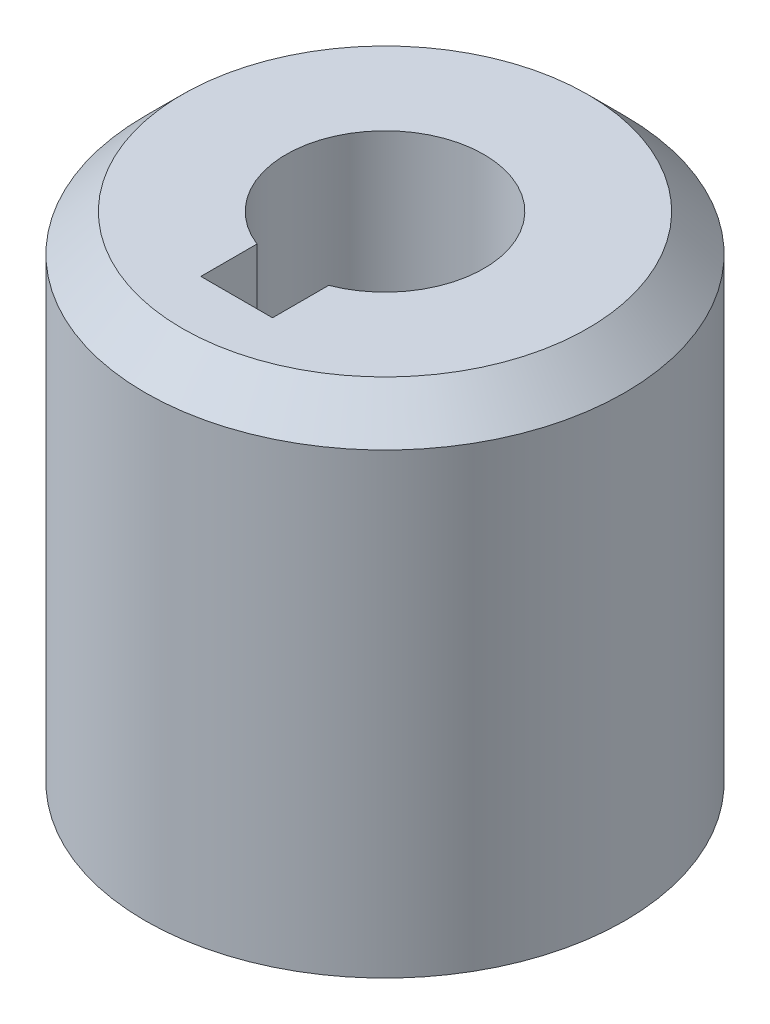
ISO-10303-21;
HEADER;
FILE_DESCRIPTION(('STEP AP214'),'2;1');
FILE_NAME('part.step','',(''),(''),'','','');
FILE_SCHEMA(('AUTOMOTIVE_DESIGN { 1 0 10303 214 1 1 1 1 }'));
ENDSEC;
DATA;
#1=APPLICATION_CONTEXT('core data for automotive mechanical design processes');
#2=APPLICATION_PROTOCOL_DEFINITION('international standard','automotive_design',2000,#1);
#3=PRODUCT_CONTEXT('',#1,'mechanical');
#4=PRODUCT('Part','Part','',(#3));
#5=PRODUCT_RELATED_PRODUCT_CATEGORY('part','',(#4));
#6=PRODUCT_DEFINITION_FORMATION('','',#4);
#7=PRODUCT_DEFINITION_CONTEXT('part definition',#1,'design');
#8=PRODUCT_DEFINITION('design','',#6,#7);
#9=PRODUCT_DEFINITION_SHAPE('','',#8);
#10=(LENGTH_UNIT() NAMED_UNIT(*) SI_UNIT(.MILLI.,.METRE.));
#11=(NAMED_UNIT(*) PLANE_ANGLE_UNIT() SI_UNIT($,.RADIAN.));
#12=(NAMED_UNIT(*) SI_UNIT($,.STERADIAN.) SOLID_ANGLE_UNIT());
#13=UNCERTAINTY_MEASURE_WITH_UNIT(LENGTH_MEASURE(1.E-05),#10,'distance_accuracy_value','');
#14=(GEOMETRIC_REPRESENTATION_CONTEXT(3) GLOBAL_UNCERTAINTY_ASSIGNED_CONTEXT((#13)) GLOBAL_UNIT_ASSIGNED_CONTEXT((#10,
#11,#12)) REPRESENTATION_CONTEXT('',''));
#15=CARTESIAN_POINT('',(0.,0.,0.));
#16=DIRECTION('',(0.,0.,1.));
#17=DIRECTION('',(1.,0.,0.));
#18=AXIS2_PLACEMENT_3D('',#15,#16,#17);
#19=CARTESIAN_POINT('',(0.,20.,0.));
#20=DIRECTION('',(0.,1.,0.));
#21=DIRECTION('',(0.,0.,1.));
#22=AXIS2_PLACEMENT_3D('',#19,#20,#21);
#23=PLANE('',#22);
#24=CARTESIAN_POINT('',(0.,20.,0.));
#25=DIRECTION('',(0.,1.,0.));
#26=DIRECTION('',(0.,0.,1.));
#27=AXIS2_PLACEMENT_3D('',#24,#25,#26);
#28=CIRCLE('',#27,8.2);
#29=CARTESIAN_POINT('',(0.,20.,8.2));
#30=VERTEX_POINT('',#29);
#31=EDGE_CURVE('E55',#30,#30,#28,.T.);
#32=ORIENTED_EDGE('',*,*,#31,.T.);
#33=EDGE_LOOP('',(#32));
#34=FACE_BOUND('',#33,.T.);
#35=DIRECTION('',(1.,0.,0.));
#36=VECTOR('',#35,1.);
#37=CARTESIAN_POINT('',(-1.45,20.,6.));
#38=LINE('',#37,#36);
#39=CARTESIAN_POINT('',(-1.45,20.,6.));
#40=VERTEX_POINT('',#39);
#41=CARTESIAN_POINT('',(1.45,20.,6.));
#42=VERTEX_POINT('',#41);
#43=EDGE_CURVE('E97',#40,#42,#38,.T.);
#44=ORIENTED_EDGE('',*,*,#43,.F.);
#45=DIRECTION('',(0.,0.,1.));
#46=VECTOR('',#45,1.);
#47=CARTESIAN_POINT('',(-1.45,20.,6.));
#48=LINE('',#47,#46);
#49=CARTESIAN_POINT('',(-1.45,20.,3.72793508527174));
#50=VERTEX_POINT('',#49);
#51=EDGE_CURVE('E88',#50,#40,#48,.T.);
#52=ORIENTED_EDGE('',*,*,#51,.F.);
#53=CARTESIAN_POINT('',(0.,20.,0.));
#54=DIRECTION('',(0.,1.,0.));
#55=DIRECTION('',(0.,0.,1.));
#56=AXIS2_PLACEMENT_3D('',#53,#54,#55);
#57=CIRCLE('',#56,4.);
#58=CARTESIAN_POINT('',(1.45,20.,3.72793508527174));
#59=VERTEX_POINT('',#58);
#60=EDGE_CURVE('E114',#59,#50,#57,.T.);
#61=ORIENTED_EDGE('',*,*,#60,.F.);
#62=DIRECTION('',(0.,0.,-1.));
#63=VECTOR('',#62,1.);
#64=CARTESIAN_POINT('',(1.45,20.,6.));
#65=LINE('',#64,#63);
#66=EDGE_CURVE('E110',#42,#59,#65,.T.);
#67=ORIENTED_EDGE('',*,*,#66,.F.);
#68=EDGE_LOOP('',(#44,#52,#61,#67));
#69=FACE_BOUND('',#68,.T.);
#70=ADVANCED_FACE('F45',(#34,#69),#23,.T.);
#71=CARTESIAN_POINT('',(0.,0.,0.));
#72=DIRECTION('',(0.,1.,0.));
#73=DIRECTION('',(0.,0.,1.));
#74=AXIS2_PLACEMENT_3D('',#71,#72,#73);
#75=PLANE('',#74);
#76=CARTESIAN_POINT('',(0.,0.,0.));
#77=DIRECTION('',(0.,1.,0.));
#78=DIRECTION('',(0.,0.,1.));
#79=AXIS2_PLACEMENT_3D('',#76,#77,#78);
#80=CIRCLE('',#79,9.7);
#81=CARTESIAN_POINT('',(0.,0.,9.7));
#82=VERTEX_POINT('',#81);
#83=EDGE_CURVE('E106',#82,#82,#80,.T.);
#84=ORIENTED_EDGE('',*,*,#83,.F.);
#85=EDGE_LOOP('',(#84));
#86=FACE_BOUND('',#85,.T.);
#87=DIRECTION('',(0.,0.,1.));
#88=VECTOR('',#87,1.);
#89=CARTESIAN_POINT('',(-1.45,0.,6.));
#90=LINE('',#89,#88);
#91=CARTESIAN_POINT('',(-1.45,0.,3.72793508527174));
#92=VERTEX_POINT('',#91);
#93=CARTESIAN_POINT('',(-1.45,0.,6.));
#94=VERTEX_POINT('',#93);
#95=EDGE_CURVE('E70',#92,#94,#90,.T.);
#96=ORIENTED_EDGE('',*,*,#95,.T.);
#97=DIRECTION('',(1.,0.,0.));
#98=VECTOR('',#97,1.);
#99=CARTESIAN_POINT('',(-1.45,0.,6.));
#100=LINE('',#99,#98);
#101=CARTESIAN_POINT('',(1.45,0.,6.));
#102=VERTEX_POINT('',#101);
#103=EDGE_CURVE('E104',#94,#102,#100,.T.);
#104=ORIENTED_EDGE('',*,*,#103,.T.);
#105=DIRECTION('',(0.,0.,-1.));
#106=VECTOR('',#105,1.);
#107=CARTESIAN_POINT('',(1.45,0.,6.));
#108=LINE('',#107,#106);
#109=CARTESIAN_POINT('',(1.45,0.,3.72793508527174));
#110=VERTEX_POINT('',#109);
#111=EDGE_CURVE('E123',#102,#110,#108,.T.);
#112=ORIENTED_EDGE('',*,*,#111,.T.);
#113=CARTESIAN_POINT('',(0.,0.,0.));
#114=DIRECTION('',(0.,1.,0.));
#115=DIRECTION('',(0.,0.,1.));
#116=AXIS2_PLACEMENT_3D('',#113,#114,#115);
#117=CIRCLE('',#116,4.);
#118=EDGE_CURVE('E98',#110,#92,#117,.T.);
#119=ORIENTED_EDGE('',*,*,#118,.T.);
#120=EDGE_LOOP('',(#96,#104,#112,#119));
#121=FACE_BOUND('',#120,.T.);
#122=ADVANCED_FACE('F153',(#86,#121),#75,.F.);
#123=CARTESIAN_POINT('',(0.,20.,0.));
#124=DIRECTION('',(0.,-1.,0.));
#125=DIRECTION('',(0.,0.,-1.));
#126=AXIS2_PLACEMENT_3D('',#123,#124,#125);
#127=CYLINDRICAL_SURFACE('',#126,9.7);
#128=CARTESIAN_POINT('',(0.,18.5,0.));
#129=DIRECTION('',(0.,1.,0.));
#130=DIRECTION('',(0.,0.,1.));
#131=AXIS2_PLACEMENT_3D('',#128,#129,#130);
#132=CIRCLE('',#131,9.7);
#133=CARTESIAN_POINT('',(0.,18.5,9.7));
#134=VERTEX_POINT('',#133);
#135=EDGE_CURVE('E11',#134,#134,#132,.F.);
#136=ORIENTED_EDGE('',*,*,#135,.T.);
#137=EDGE_LOOP('',(#136));
#138=FACE_BOUND('',#137,.T.);
#139=ORIENTED_EDGE('',*,*,#83,.T.);
#140=EDGE_LOOP('',(#139));
#141=FACE_BOUND('',#140,.T.);
#142=ADVANCED_FACE('F158',(#138,#141),#127,.T.);
#143=CARTESIAN_POINT('',(-1.45,20.,6.));
#144=DIRECTION('',(1.,0.,0.));
#145=DIRECTION('',(0.,0.,-1.));
#146=AXIS2_PLACEMENT_3D('',#143,#144,#145);
#147=PLANE('',#146);
#148=ORIENTED_EDGE('',*,*,#95,.F.);
#149=DIRECTION('',(0.,-1.,0.));
#150=VECTOR('',#149,1.);
#151=CARTESIAN_POINT('',(-1.45,20.,3.72793508527174));
#152=LINE('',#151,#150);
#153=EDGE_CURVE('E92',#50,#92,#152,.T.);
#154=ORIENTED_EDGE('',*,*,#153,.F.);
#155=ORIENTED_EDGE('',*,*,#51,.T.);
#156=DIRECTION('',(0.,-1.,0.));
#157=VECTOR('',#156,1.);
#158=CARTESIAN_POINT('',(-1.45,20.,6.));
#159=LINE('',#158,#157);
#160=EDGE_CURVE('E91',#40,#94,#159,.T.);
#161=ORIENTED_EDGE('',*,*,#160,.T.);
#162=EDGE_LOOP('',(#148,#154,#155,#161));
#163=FACE_BOUND('',#162,.T.);
#164=ADVANCED_FACE('F90',(#163),#147,.T.);
#165=CARTESIAN_POINT('',(-1.45,20.,6.));
#166=DIRECTION('',(0.,0.,-1.));
#167=DIRECTION('',(-1.,0.,0.));
#168=AXIS2_PLACEMENT_3D('',#165,#166,#167);
#169=PLANE('',#168);
#170=ORIENTED_EDGE('',*,*,#103,.F.);
#171=ORIENTED_EDGE('',*,*,#160,.F.);
#172=ORIENTED_EDGE('',*,*,#43,.T.);
#173=DIRECTION('',(0.,-1.,0.));
#174=VECTOR('',#173,1.);
#175=CARTESIAN_POINT('',(1.45,20.,6.));
#176=LINE('',#175,#174);
#177=EDGE_CURVE('E107',#42,#102,#176,.T.);
#178=ORIENTED_EDGE('',*,*,#177,.T.);
#179=EDGE_LOOP('',(#170,#171,#172,#178));
#180=FACE_BOUND('',#179,.T.);
#181=ADVANCED_FACE('F101',(#180),#169,.T.);
#182=CARTESIAN_POINT('',(1.45,20.,6.));
#183=DIRECTION('',(-1.,0.,0.));
#184=DIRECTION('',(0.,0.,1.));
#185=AXIS2_PLACEMENT_3D('',#182,#183,#184);
#186=PLANE('',#185);
#187=ORIENTED_EDGE('',*,*,#111,.F.);
#188=ORIENTED_EDGE('',*,*,#177,.F.);
#189=ORIENTED_EDGE('',*,*,#66,.T.);
#190=DIRECTION('',(0.,-1.,0.));
#191=VECTOR('',#190,1.);
#192=CARTESIAN_POINT('',(1.45,20.,3.72793508527174));
#193=LINE('',#192,#191);
#194=EDGE_CURVE('E62',#59,#110,#193,.T.);
#195=ORIENTED_EDGE('',*,*,#194,.T.);
#196=EDGE_LOOP('',(#187,#188,#189,#195));
#197=FACE_BOUND('',#196,.T.);
#198=ADVANCED_FACE('F149',(#197),#186,.T.);
#199=CARTESIAN_POINT('',(0.,20.,0.));
#200=DIRECTION('',(0.,-1.,0.));
#201=DIRECTION('',(0.,0.,-1.));
#202=AXIS2_PLACEMENT_3D('',#199,#200,#201);
#203=CYLINDRICAL_SURFACE('',#202,4.);
#204=ORIENTED_EDGE('',*,*,#118,.F.);
#205=ORIENTED_EDGE('',*,*,#194,.F.);
#206=ORIENTED_EDGE('',*,*,#60,.T.);
#207=ORIENTED_EDGE('',*,*,#153,.T.);
#208=EDGE_LOOP('',(#204,#205,#206,#207));
#209=FACE_BOUND('',#208,.T.);
#210=ADVANCED_FACE('F144',(#209),#203,.F.);
#211=CARTESIAN_POINT('',(0.,20.,0.));
#212=DIRECTION('',(0.,-1.,0.));
#213=DIRECTION('',(0.,0.,-1.));
#214=AXIS2_PLACEMENT_3D('',#211,#212,#213);
#215=CONICAL_SURFACE('',#214,8.2,0.785398163397448);
#216=ORIENTED_EDGE('',*,*,#135,.F.);
#217=EDGE_LOOP('',(#216));
#218=FACE_BOUND('',#217,.T.);
#219=ORIENTED_EDGE('',*,*,#31,.F.);
#220=EDGE_LOOP('',(#219));
#221=FACE_BOUND('',#220,.T.);
#222=ADVANCED_FACE('F48',(#218,#221),#215,.T.);
#223=CLOSED_SHELL('',(#70,#122,#142,#164,#181,#198,#210,#222));
#224=MANIFOLD_SOLID_BREP('B2',#223);
#225=ADVANCED_BREP_SHAPE_REPRESENTATION('',(#18,#224),#14);
#226=SHAPE_DEFINITION_REPRESENTATION(#9,#225);
ENDSEC;
END-ISO-10303-21;
